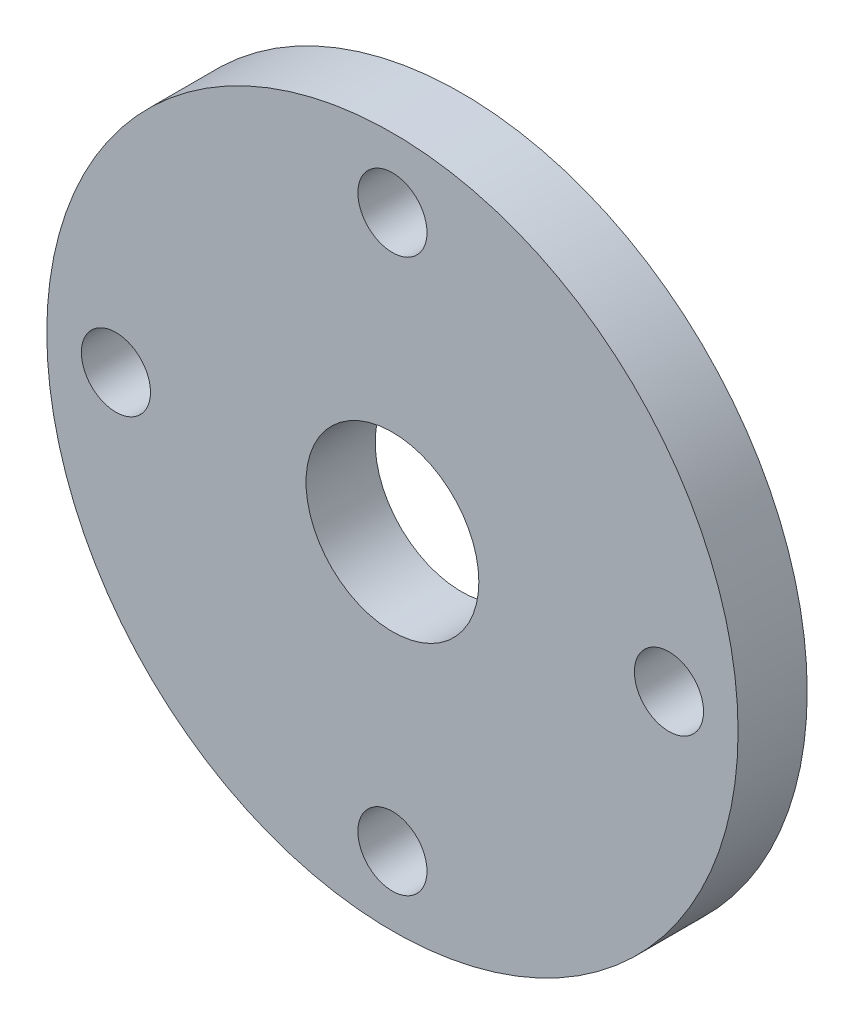
ISO-10303-21;
HEADER;
FILE_DESCRIPTION(('STEP AP214'),'2;1');
FILE_NAME('part.step','',(''),(''),'','','');
FILE_SCHEMA(('AUTOMOTIVE_DESIGN { 1 0 10303 214 1 1 1 1 }'));
ENDSEC;
DATA;
#1=APPLICATION_CONTEXT('core data for automotive mechanical design processes');
#2=APPLICATION_PROTOCOL_DEFINITION('international standard','automotive_design',2000,#1);
#3=PRODUCT_CONTEXT('',#1,'mechanical');
#4=PRODUCT('Part','Part','',(#3));
#5=PRODUCT_RELATED_PRODUCT_CATEGORY('part','',(#4));
#6=PRODUCT_DEFINITION_FORMATION('','',#4);
#7=PRODUCT_DEFINITION_CONTEXT('part definition',#1,'design');
#8=PRODUCT_DEFINITION('design','',#6,#7);
#9=PRODUCT_DEFINITION_SHAPE('','',#8);
#10=(LENGTH_UNIT() NAMED_UNIT(*) SI_UNIT(.MILLI.,.METRE.));
#11=(NAMED_UNIT(*) PLANE_ANGLE_UNIT() SI_UNIT($,.RADIAN.));
#12=(NAMED_UNIT(*) SI_UNIT($,.STERADIAN.) SOLID_ANGLE_UNIT());
#13=UNCERTAINTY_MEASURE_WITH_UNIT(LENGTH_MEASURE(1.E-05),#10,'distance_accuracy_value','');
#14=(GEOMETRIC_REPRESENTATION_CONTEXT(3) GLOBAL_UNCERTAINTY_ASSIGNED_CONTEXT((#13)) GLOBAL_UNIT_ASSIGNED_CONTEXT((#10,
#11,#12)) REPRESENTATION_CONTEXT('',''));
#15=CARTESIAN_POINT('',(0.,0.,0.));
#16=DIRECTION('',(0.,0.,1.));
#17=DIRECTION('',(1.,0.,0.));
#18=AXIS2_PLACEMENT_3D('',#15,#16,#17);
#19=CARTESIAN_POINT('',(0.,0.,1.));
#20=DIRECTION('',(0.,0.,1.));
#21=DIRECTION('',(1.,0.,0.));
#22=AXIS2_PLACEMENT_3D('',#19,#20,#21);
#23=PLANE('',#22);
#24=CARTESIAN_POINT('',(4.,0.,1.));
#25=DIRECTION('',(0.,0.,1.));
#26=DIRECTION('',(1.,0.,0.));
#27=AXIS2_PLACEMENT_3D('',#24,#25,#26);
#28=CIRCLE('',#27,0.5);
#29=CARTESIAN_POINT('',(4.5,0.,1.));
#30=VERTEX_POINT('',#29);
#31=EDGE_CURVE('E72',#30,#30,#28,.T.);
#32=ORIENTED_EDGE('',*,*,#31,.F.);
#33=EDGE_LOOP('',(#32));
#34=FACE_BOUND('',#33,.T.);
#35=CARTESIAN_POINT('',(0.,0.,1.));
#36=DIRECTION('',(0.,0.,1.));
#37=DIRECTION('',(1.,0.,0.));
#38=AXIS2_PLACEMENT_3D('',#35,#36,#37);
#39=CIRCLE('',#38,1.25);
#40=CARTESIAN_POINT('',(1.25,0.,1.));
#41=VERTEX_POINT('',#40);
#42=EDGE_CURVE('E56',#41,#41,#39,.T.);
#43=ORIENTED_EDGE('',*,*,#42,.F.);
#44=EDGE_LOOP('',(#43));
#45=FACE_BOUND('',#44,.T.);
#46=CARTESIAN_POINT('',(0.,0.,1.));
#47=DIRECTION('',(0.,0.,1.));
#48=DIRECTION('',(1.,0.,0.));
#49=AXIS2_PLACEMENT_3D('',#46,#47,#48);
#50=CIRCLE('',#49,5.);
#51=CARTESIAN_POINT('',(5.,0.,1.));
#52=VERTEX_POINT('',#51);
#53=EDGE_CURVE('E10',#52,#52,#50,.T.);
#54=ORIENTED_EDGE('',*,*,#53,.T.);
#55=EDGE_LOOP('',(#54));
#56=FACE_BOUND('',#55,.T.);
#57=CARTESIAN_POINT('',(-4.,0.,1.));
#58=DIRECTION('',(0.,0.,1.));
#59=DIRECTION('',(1.,0.,0.));
#60=AXIS2_PLACEMENT_3D('',#57,#58,#59);
#61=CIRCLE('',#60,0.5);
#62=CARTESIAN_POINT('',(-3.5,0.,1.));
#63=VERTEX_POINT('',#62);
#64=EDGE_CURVE('E50',#63,#63,#61,.T.);
#65=ORIENTED_EDGE('',*,*,#64,.F.);
#66=EDGE_LOOP('',(#65));
#67=FACE_BOUND('',#66,.T.);
#68=CARTESIAN_POINT('',(0.,4.,1.));
#69=DIRECTION('',(0.,0.,1.));
#70=DIRECTION('',(1.,0.,0.));
#71=AXIS2_PLACEMENT_3D('',#68,#69,#70);
#72=CIRCLE('',#71,0.5);
#73=CARTESIAN_POINT('',(0.500000000000014,4.,1.));
#74=VERTEX_POINT('',#73);
#75=EDGE_CURVE('E64',#74,#74,#72,.T.);
#76=ORIENTED_EDGE('',*,*,#75,.F.);
#77=EDGE_LOOP('',(#76));
#78=FACE_BOUND('',#77,.T.);
#79=CARTESIAN_POINT('',(0.,-4.,1.));
#80=DIRECTION('',(0.,0.,1.));
#81=DIRECTION('',(1.,0.,0.));
#82=AXIS2_PLACEMENT_3D('',#79,#80,#81);
#83=CIRCLE('',#82,0.5);
#84=CARTESIAN_POINT('',(0.499999999999958,-4.,1.));
#85=VERTEX_POINT('',#84);
#86=EDGE_CURVE('E80',#85,#85,#83,.T.);
#87=ORIENTED_EDGE('',*,*,#86,.F.);
#88=EDGE_LOOP('',(#87));
#89=FACE_BOUND('',#88,.T.);
#90=ADVANCED_FACE('F37',(#34,#45,#56,#67,#78,#89),#23,.T.);
#91=CARTESIAN_POINT('',(0.,0.,0.));
#92=DIRECTION('',(0.,0.,1.));
#93=DIRECTION('',(1.,0.,0.));
#94=AXIS2_PLACEMENT_3D('',#91,#92,#93);
#95=PLANE('',#94);
#96=CARTESIAN_POINT('',(0.,0.,0.));
#97=DIRECTION('',(0.,0.,1.));
#98=DIRECTION('',(1.,0.,0.));
#99=AXIS2_PLACEMENT_3D('',#96,#97,#98);
#100=CIRCLE('',#99,5.);
#101=CARTESIAN_POINT('',(5.,0.,0.));
#102=VERTEX_POINT('',#101);
#103=EDGE_CURVE('E41',#102,#102,#100,.T.);
#104=ORIENTED_EDGE('',*,*,#103,.F.);
#105=EDGE_LOOP('',(#104));
#106=FACE_BOUND('',#105,.T.);
#107=CARTESIAN_POINT('',(-4.,0.,0.));
#108=DIRECTION('',(0.,0.,1.));
#109=DIRECTION('',(1.,0.,0.));
#110=AXIS2_PLACEMENT_3D('',#107,#108,#109);
#111=CIRCLE('',#110,0.5);
#112=CARTESIAN_POINT('',(-3.5,0.,0.));
#113=VERTEX_POINT('',#112);
#114=EDGE_CURVE('E52',#113,#113,#111,.T.);
#115=ORIENTED_EDGE('',*,*,#114,.T.);
#116=EDGE_LOOP('',(#115));
#117=FACE_BOUND('',#116,.T.);
#118=CARTESIAN_POINT('',(0.,0.,0.));
#119=DIRECTION('',(0.,0.,1.));
#120=DIRECTION('',(1.,0.,0.));
#121=AXIS2_PLACEMENT_3D('',#118,#119,#120);
#122=CIRCLE('',#121,1.25);
#123=CARTESIAN_POINT('',(1.25,0.,0.));
#124=VERTEX_POINT('',#123);
#125=EDGE_CURVE('E60',#124,#124,#122,.T.);
#126=ORIENTED_EDGE('',*,*,#125,.T.);
#127=EDGE_LOOP('',(#126));
#128=FACE_BOUND('',#127,.T.);
#129=CARTESIAN_POINT('',(0.,4.,0.));
#130=DIRECTION('',(0.,0.,1.));
#131=DIRECTION('',(1.,0.,0.));
#132=AXIS2_PLACEMENT_3D('',#129,#130,#131);
#133=CIRCLE('',#132,0.5);
#134=CARTESIAN_POINT('',(0.500000000000014,4.,0.));
#135=VERTEX_POINT('',#134);
#136=EDGE_CURVE('E68',#135,#135,#133,.T.);
#137=ORIENTED_EDGE('',*,*,#136,.T.);
#138=EDGE_LOOP('',(#137));
#139=FACE_BOUND('',#138,.T.);
#140=CARTESIAN_POINT('',(4.,0.,0.));
#141=DIRECTION('',(0.,0.,1.));
#142=DIRECTION('',(1.,0.,0.));
#143=AXIS2_PLACEMENT_3D('',#140,#141,#142);
#144=CIRCLE('',#143,0.5);
#145=CARTESIAN_POINT('',(4.5,0.,0.));
#146=VERTEX_POINT('',#145);
#147=EDGE_CURVE('E76',#146,#146,#144,.T.);
#148=ORIENTED_EDGE('',*,*,#147,.T.);
#149=EDGE_LOOP('',(#148));
#150=FACE_BOUND('',#149,.T.);
#151=CARTESIAN_POINT('',(0.,-4.,0.));
#152=DIRECTION('',(0.,0.,1.));
#153=DIRECTION('',(1.,0.,0.));
#154=AXIS2_PLACEMENT_3D('',#151,#152,#153);
#155=CIRCLE('',#154,0.5);
#156=CARTESIAN_POINT('',(0.499999999999958,-4.,0.));
#157=VERTEX_POINT('',#156);
#158=EDGE_CURVE('E84',#157,#157,#155,.T.);
#159=ORIENTED_EDGE('',*,*,#158,.T.);
#160=EDGE_LOOP('',(#159));
#161=FACE_BOUND('',#160,.T.);
#162=ADVANCED_FACE('F96',(#106,#117,#128,#139,#150,#161),#95,.F.);
#163=CARTESIAN_POINT('',(0.,0.,1.));
#164=DIRECTION('',(0.,0.,-1.));
#165=DIRECTION('',(-1.,0.,0.));
#166=AXIS2_PLACEMENT_3D('',#163,#164,#165);
#167=CYLINDRICAL_SURFACE('',#166,5.);
#168=ORIENTED_EDGE('',*,*,#53,.F.);
#169=EDGE_LOOP('',(#168));
#170=FACE_BOUND('',#169,.T.);
#171=ORIENTED_EDGE('',*,*,#103,.T.);
#172=EDGE_LOOP('',(#171));
#173=FACE_BOUND('',#172,.T.);
#174=ADVANCED_FACE('F39',(#170,#173),#167,.T.);
#175=CARTESIAN_POINT('',(-4.,0.,1.));
#176=DIRECTION('',(0.,0.,-1.));
#177=DIRECTION('',(-1.,0.,0.));
#178=AXIS2_PLACEMENT_3D('',#175,#176,#177);
#179=CYLINDRICAL_SURFACE('',#178,0.5);
#180=ORIENTED_EDGE('',*,*,#64,.T.);
#181=EDGE_LOOP('',(#180));
#182=FACE_BOUND('',#181,.T.);
#183=ORIENTED_EDGE('',*,*,#114,.F.);
#184=EDGE_LOOP('',(#183));
#185=FACE_BOUND('',#184,.T.);
#186=ADVANCED_FACE('F106',(#182,#185),#179,.F.);
#187=CARTESIAN_POINT('',(0.,0.,1.));
#188=DIRECTION('',(0.,0.,-1.));
#189=DIRECTION('',(-1.,0.,0.));
#190=AXIS2_PLACEMENT_3D('',#187,#188,#189);
#191=CYLINDRICAL_SURFACE('',#190,1.25);
#192=ORIENTED_EDGE('',*,*,#42,.T.);
#193=EDGE_LOOP('',(#192));
#194=FACE_BOUND('',#193,.T.);
#195=ORIENTED_EDGE('',*,*,#125,.F.);
#196=EDGE_LOOP('',(#195));
#197=FACE_BOUND('',#196,.T.);
#198=ADVANCED_FACE('F109',(#194,#197),#191,.F.);
#199=CARTESIAN_POINT('',(0.,4.,1.));
#200=DIRECTION('',(0.,0.,-1.));
#201=DIRECTION('',(-1.,0.,0.));
#202=AXIS2_PLACEMENT_3D('',#199,#200,#201);
#203=CYLINDRICAL_SURFACE('',#202,0.5);
#204=ORIENTED_EDGE('',*,*,#75,.T.);
#205=EDGE_LOOP('',(#204));
#206=FACE_BOUND('',#205,.T.);
#207=ORIENTED_EDGE('',*,*,#136,.F.);
#208=EDGE_LOOP('',(#207));
#209=FACE_BOUND('',#208,.T.);
#210=ADVANCED_FACE('F113',(#206,#209),#203,.F.);
#211=CARTESIAN_POINT('',(4.,0.,1.));
#212=DIRECTION('',(0.,0.,-1.));
#213=DIRECTION('',(-1.,0.,0.));
#214=AXIS2_PLACEMENT_3D('',#211,#212,#213);
#215=CYLINDRICAL_SURFACE('',#214,0.5);
#216=ORIENTED_EDGE('',*,*,#31,.T.);
#217=EDGE_LOOP('',(#216));
#218=FACE_BOUND('',#217,.T.);
#219=ORIENTED_EDGE('',*,*,#147,.F.);
#220=EDGE_LOOP('',(#219));
#221=FACE_BOUND('',#220,.T.);
#222=ADVANCED_FACE('F117',(#218,#221),#215,.F.);
#223=CARTESIAN_POINT('',(0.,-4.,1.));
#224=DIRECTION('',(0.,0.,-1.));
#225=DIRECTION('',(-1.,0.,0.));
#226=AXIS2_PLACEMENT_3D('',#223,#224,#225);
#227=CYLINDRICAL_SURFACE('',#226,0.5);
#228=ORIENTED_EDGE('',*,*,#86,.T.);
#229=EDGE_LOOP('',(#228));
#230=FACE_BOUND('',#229,.T.);
#231=ORIENTED_EDGE('',*,*,#158,.F.);
#232=EDGE_LOOP('',(#231));
#233=FACE_BOUND('',#232,.T.);
#234=ADVANCED_FACE('F92',(#230,#233),#227,.F.);
#235=CLOSED_SHELL('',(#90,#162,#174,#186,#198,#210,#222,#234));
#236=MANIFOLD_SOLID_BREP('B2',#235);
#237=ADVANCED_BREP_SHAPE_REPRESENTATION('',(#18,#236),#14);
#238=SHAPE_DEFINITION_REPRESENTATION(#9,#237);
ENDSEC;
END-ISO-10303-21;
